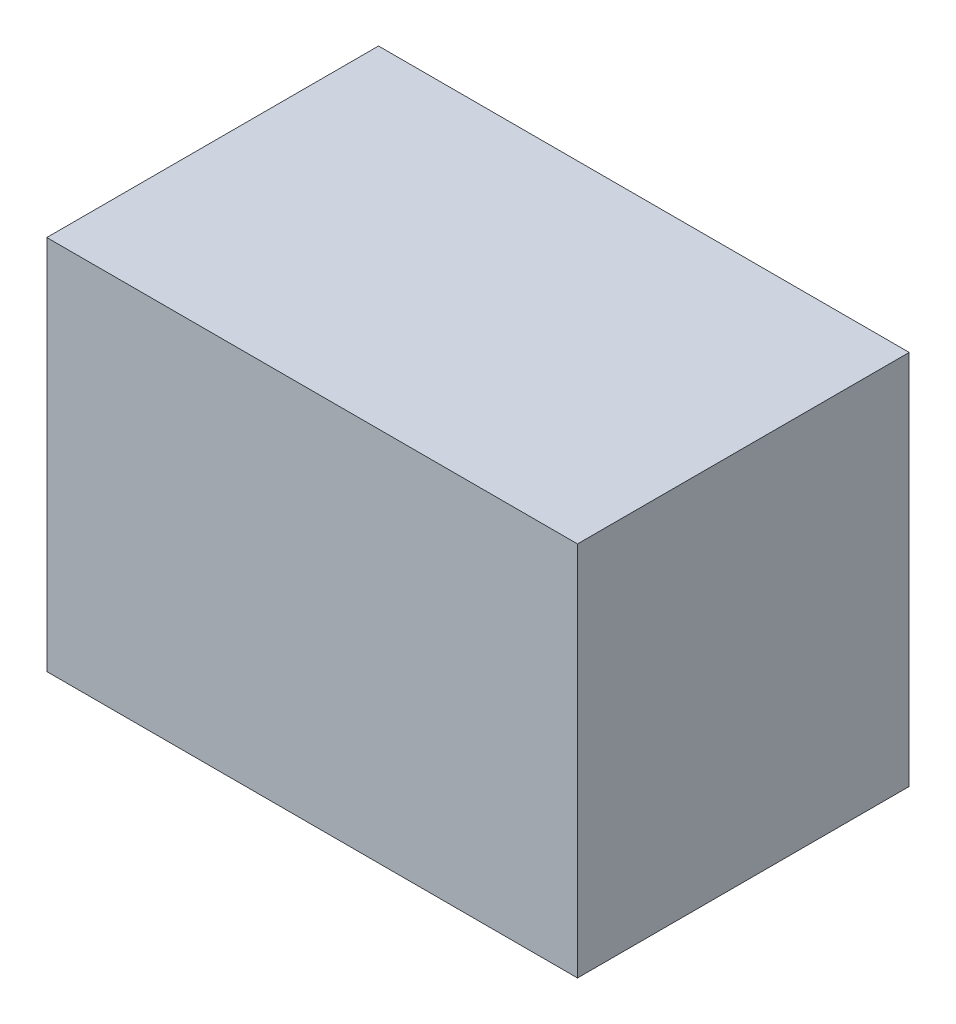
ISO-10303-21;
HEADER;
FILE_DESCRIPTION(('STEP AP214'),'2;1');
FILE_NAME('part.step','',(''),(''),'','','');
FILE_SCHEMA(('AUTOMOTIVE_DESIGN { 1 0 10303 214 1 1 1 1 }'));
ENDSEC;
DATA;
#1=APPLICATION_CONTEXT('core data for automotive mechanical design processes');
#2=APPLICATION_PROTOCOL_DEFINITION('international standard','automotive_design',2000,#1);
#3=PRODUCT_CONTEXT('',#1,'mechanical');
#4=PRODUCT('Part','Part','',(#3));
#5=PRODUCT_RELATED_PRODUCT_CATEGORY('part','',(#4));
#6=PRODUCT_DEFINITION_FORMATION('','',#4);
#7=PRODUCT_DEFINITION_CONTEXT('part definition',#1,'design');
#8=PRODUCT_DEFINITION('design','',#6,#7);
#9=PRODUCT_DEFINITION_SHAPE('','',#8);
#10=(LENGTH_UNIT() NAMED_UNIT(*) SI_UNIT(.MILLI.,.METRE.));
#11=(NAMED_UNIT(*) PLANE_ANGLE_UNIT() SI_UNIT($,.RADIAN.));
#12=(NAMED_UNIT(*) SI_UNIT($,.STERADIAN.) SOLID_ANGLE_UNIT());
#13=UNCERTAINTY_MEASURE_WITH_UNIT(LENGTH_MEASURE(1.E-05),#10,'distance_accuracy_value','');
#14=(GEOMETRIC_REPRESENTATION_CONTEXT(3) GLOBAL_UNCERTAINTY_ASSIGNED_CONTEXT((#13)) GLOBAL_UNIT_ASSIGNED_CONTEXT((#10,
#11,#12)) REPRESENTATION_CONTEXT('',''));
#15=CARTESIAN_POINT('',(0.,0.,0.));
#16=DIRECTION('',(0.,0.,1.));
#17=DIRECTION('',(1.,0.,0.));
#18=AXIS2_PLACEMENT_3D('',#15,#16,#17);
#19=CARTESIAN_POINT('',(0.,0.,0.75));
#20=DIRECTION('',(0.,0.,1.));
#21=DIRECTION('',(1.,0.,0.));
#22=AXIS2_PLACEMENT_3D('',#19,#20,#21);
#23=PLANE('',#22);
#24=DIRECTION('',(0.,1.,0.));
#25=VECTOR('',#24,1.);
#26=CARTESIAN_POINT('',(0.6,0.425,0.75));
#27=LINE('',#26,#25);
#28=CARTESIAN_POINT('',(0.6,0.425,0.75));
#29=VERTEX_POINT('',#28);
#30=CARTESIAN_POINT('',(0.6,-0.425,0.75));
#31=VERTEX_POINT('',#30);
#32=EDGE_CURVE('E53',#29,#31,#27,.F.);
#33=ORIENTED_EDGE('',*,*,#32,.F.);
#34=DIRECTION('',(1.,0.,0.));
#35=VECTOR('',#34,1.);
#36=CARTESIAN_POINT('',(-0.6,0.425,0.75));
#37=LINE('',#36,#35);
#38=CARTESIAN_POINT('',(-0.6,0.425,0.75));
#39=VERTEX_POINT('',#38);
#40=EDGE_CURVE('E68',#39,#29,#37,.T.);
#41=ORIENTED_EDGE('',*,*,#40,.F.);
#42=DIRECTION('',(0.,1.,0.));
#43=VECTOR('',#42,1.);
#44=CARTESIAN_POINT('',(-0.6,-0.425,0.75));
#45=LINE('',#44,#43);
#46=CARTESIAN_POINT('',(-0.6,-0.425,0.75));
#47=VERTEX_POINT('',#46);
#48=EDGE_CURVE('E20',#47,#39,#45,.T.);
#49=ORIENTED_EDGE('',*,*,#48,.F.);
#50=DIRECTION('',(1.,0.,0.));
#51=VECTOR('',#50,1.);
#52=CARTESIAN_POINT('',(0.6,-0.425,0.75));
#53=LINE('',#52,#51);
#54=EDGE_CURVE('E58',#31,#47,#53,.F.);
#55=ORIENTED_EDGE('',*,*,#54,.F.);
#56=EDGE_LOOP('',(#33,#41,#49,#55));
#57=FACE_BOUND('',#56,.T.);
#58=ADVANCED_FACE('F17',(#57),#23,.T.);
#59=CARTESIAN_POINT('',(-0.6,-0.425,0.));
#60=DIRECTION('',(-1.,0.,0.));
#61=DIRECTION('',(0.,0.,1.));
#62=AXIS2_PLACEMENT_3D('',#59,#60,#61);
#63=PLANE('',#62);
#64=DIRECTION('',(0.,0.,1.));
#65=VECTOR('',#64,1.);
#66=CARTESIAN_POINT('',(-0.6,0.425,0.));
#67=LINE('',#66,#65);
#68=CARTESIAN_POINT('',(-0.6,0.425,0.));
#69=VERTEX_POINT('',#68);
#70=EDGE_CURVE('E79',#69,#39,#67,.T.);
#71=ORIENTED_EDGE('',*,*,#70,.F.);
#72=DIRECTION('',(0.,1.,0.));
#73=VECTOR('',#72,1.);
#74=CARTESIAN_POINT('',(-0.6,0.,0.));
#75=LINE('',#74,#73);
#76=CARTESIAN_POINT('',(-0.6,-0.425,0.));
#77=VERTEX_POINT('',#76);
#78=EDGE_CURVE('E74',#69,#77,#75,.F.);
#79=ORIENTED_EDGE('',*,*,#78,.T.);
#80=DIRECTION('',(0.,0.,-1.));
#81=VECTOR('',#80,1.);
#82=CARTESIAN_POINT('',(-0.6,-0.425,0.));
#83=LINE('',#82,#81);
#84=EDGE_CURVE('E63',#47,#77,#83,.T.);
#85=ORIENTED_EDGE('',*,*,#84,.F.);
#86=ORIENTED_EDGE('',*,*,#48,.T.);
#87=EDGE_LOOP('',(#71,#79,#85,#86));
#88=FACE_BOUND('',#87,.T.);
#89=ADVANCED_FACE('F73',(#88),#63,.T.);
#90=CARTESIAN_POINT('',(0.6,-0.425,0.));
#91=DIRECTION('',(0.,-1.,0.));
#92=DIRECTION('',(0.,0.,-1.));
#93=AXIS2_PLACEMENT_3D('',#90,#91,#92);
#94=PLANE('',#93);
#95=ORIENTED_EDGE('',*,*,#84,.T.);
#96=DIRECTION('',(1.,0.,0.));
#97=VECTOR('',#96,1.);
#98=CARTESIAN_POINT('',(0.,-0.425,0.));
#99=LINE('',#98,#97);
#100=CARTESIAN_POINT('',(0.6,-0.425,0.));
#101=VERTEX_POINT('',#100);
#102=EDGE_CURVE('E84',#77,#101,#99,.T.);
#103=ORIENTED_EDGE('',*,*,#102,.T.);
#104=DIRECTION('',(0.,0.,-1.));
#105=VECTOR('',#104,1.);
#106=CARTESIAN_POINT('',(0.6,-0.425,0.));
#107=LINE('',#106,#105);
#108=EDGE_CURVE('E65',#31,#101,#107,.T.);
#109=ORIENTED_EDGE('',*,*,#108,.F.);
#110=ORIENTED_EDGE('',*,*,#54,.T.);
#111=EDGE_LOOP('',(#95,#103,#109,#110));
#112=FACE_BOUND('',#111,.T.);
#113=ADVANCED_FACE('F60',(#112),#94,.T.);
#114=CARTESIAN_POINT('',(0.6,0.425,0.));
#115=DIRECTION('',(1.,0.,0.));
#116=DIRECTION('',(0.,0.,-1.));
#117=AXIS2_PLACEMENT_3D('',#114,#115,#116);
#118=PLANE('',#117);
#119=ORIENTED_EDGE('',*,*,#108,.T.);
#120=DIRECTION('',(0.,1.,0.));
#121=VECTOR('',#120,1.);
#122=CARTESIAN_POINT('',(0.6,0.,0.));
#123=LINE('',#122,#121);
#124=CARTESIAN_POINT('',(0.6,0.425,0.));
#125=VERTEX_POINT('',#124);
#126=EDGE_CURVE('E26',#101,#125,#123,.T.);
#127=ORIENTED_EDGE('',*,*,#126,.T.);
#128=DIRECTION('',(0.,0.,1.));
#129=VECTOR('',#128,1.);
#130=CARTESIAN_POINT('',(0.6,0.425,0.));
#131=LINE('',#130,#129);
#132=EDGE_CURVE('E34',#29,#125,#131,.F.);
#133=ORIENTED_EDGE('',*,*,#132,.F.);
#134=ORIENTED_EDGE('',*,*,#32,.T.);
#135=EDGE_LOOP('',(#119,#127,#133,#134));
#136=FACE_BOUND('',#135,.T.);
#137=ADVANCED_FACE('F88',(#136),#118,.T.);
#138=CARTESIAN_POINT('',(-0.6,0.425,0.));
#139=DIRECTION('',(0.,1.,0.));
#140=DIRECTION('',(0.,0.,1.));
#141=AXIS2_PLACEMENT_3D('',#138,#139,#140);
#142=PLANE('',#141);
#143=ORIENTED_EDGE('',*,*,#132,.T.);
#144=DIRECTION('',(1.,0.,0.));
#145=VECTOR('',#144,1.);
#146=CARTESIAN_POINT('',(0.,0.425,0.));
#147=LINE('',#146,#145);
#148=EDGE_CURVE('E11',#125,#69,#147,.F.);
#149=ORIENTED_EDGE('',*,*,#148,.T.);
#150=ORIENTED_EDGE('',*,*,#70,.T.);
#151=ORIENTED_EDGE('',*,*,#40,.T.);
#152=EDGE_LOOP('',(#143,#149,#150,#151));
#153=FACE_BOUND('',#152,.T.);
#154=ADVANCED_FACE('F91',(#153),#142,.T.);
#155=CARTESIAN_POINT('',(0.,0.,0.));
#156=DIRECTION('',(0.,0.,1.));
#157=DIRECTION('',(1.,0.,0.));
#158=AXIS2_PLACEMENT_3D('',#155,#156,#157);
#159=PLANE('',#158);
#160=ORIENTED_EDGE('',*,*,#126,.F.);
#161=ORIENTED_EDGE('',*,*,#102,.F.);
#162=ORIENTED_EDGE('',*,*,#78,.F.);
#163=ORIENTED_EDGE('',*,*,#148,.F.);
#164=EDGE_LOOP('',(#160,#161,#162,#163));
#165=FACE_BOUND('',#164,.T.);
#166=ADVANCED_FACE('F90',(#165),#159,.F.);
#167=CLOSED_SHELL('',(#58,#89,#113,#137,#154,#166));
#168=MANIFOLD_SOLID_BREP('B1',#167);
#169=ADVANCED_BREP_SHAPE_REPRESENTATION('',(#18,#168),#14);
#170=SHAPE_DEFINITION_REPRESENTATION(#9,#169);
ENDSEC;
END-ISO-10303-21;
